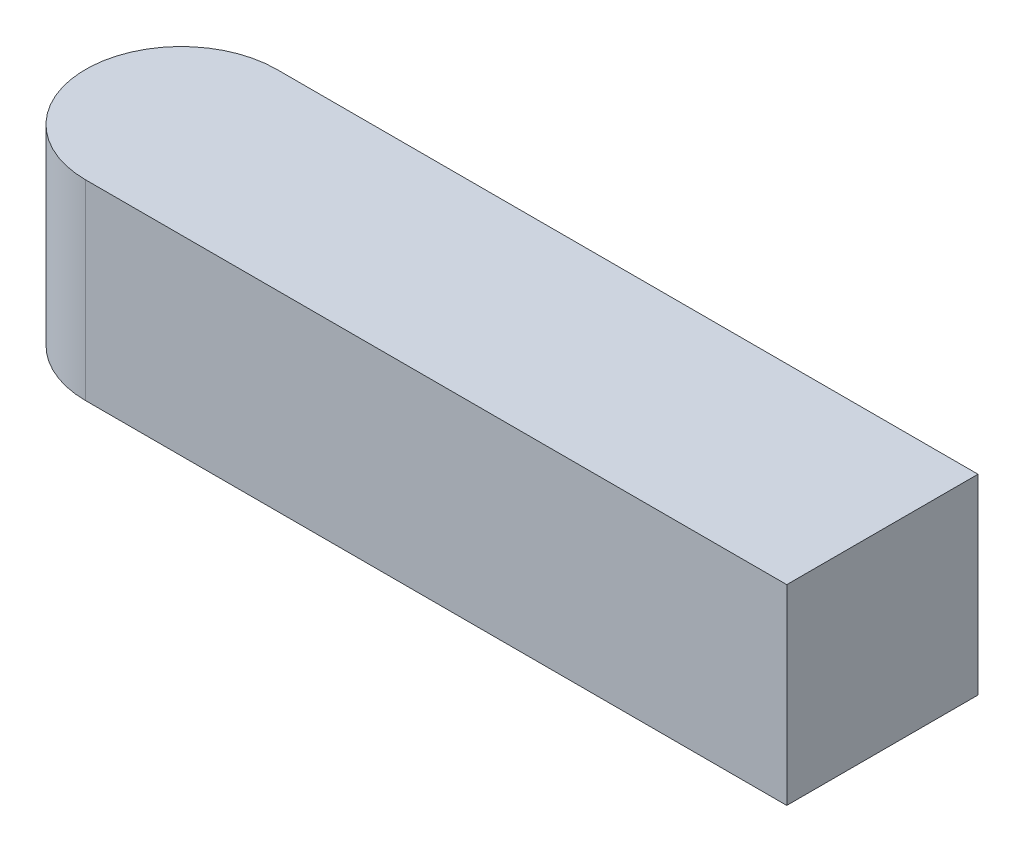
ISO-10303-21;
HEADER;
FILE_DESCRIPTION(('STEP AP214'),'2;1');
FILE_NAME('part.step','',(''),(''),'','','');
FILE_SCHEMA(('AUTOMOTIVE_DESIGN { 1 0 10303 214 1 1 1 1 }'));
ENDSEC;
DATA;
#1=APPLICATION_CONTEXT('core data for automotive mechanical design processes');
#2=APPLICATION_PROTOCOL_DEFINITION('international standard','automotive_design',2000,#1);
#3=PRODUCT_CONTEXT('',#1,'mechanical');
#4=PRODUCT('Part','Part','',(#3));
#5=PRODUCT_RELATED_PRODUCT_CATEGORY('part','',(#4));
#6=PRODUCT_DEFINITION_FORMATION('','',#4);
#7=PRODUCT_DEFINITION_CONTEXT('part definition',#1,'design');
#8=PRODUCT_DEFINITION('design','',#6,#7);
#9=PRODUCT_DEFINITION_SHAPE('','',#8);
#10=(LENGTH_UNIT() NAMED_UNIT(*) SI_UNIT(.MILLI.,.METRE.));
#11=(NAMED_UNIT(*) PLANE_ANGLE_UNIT() SI_UNIT($,.RADIAN.));
#12=(NAMED_UNIT(*) SI_UNIT($,.STERADIAN.) SOLID_ANGLE_UNIT());
#13=UNCERTAINTY_MEASURE_WITH_UNIT(LENGTH_MEASURE(1.E-05),#10,'distance_accuracy_value','');
#14=(GEOMETRIC_REPRESENTATION_CONTEXT(3) GLOBAL_UNCERTAINTY_ASSIGNED_CONTEXT((#13)) GLOBAL_UNIT_ASSIGNED_CONTEXT((#10,
#11,#12)) REPRESENTATION_CONTEXT('',''));
#15=CARTESIAN_POINT('',(0.,0.,0.));
#16=DIRECTION('',(0.,0.,1.));
#17=DIRECTION('',(1.,0.,0.));
#18=AXIS2_PLACEMENT_3D('',#15,#16,#17);
#19=CARTESIAN_POINT('',(-44.,12.,0.));
#20=DIRECTION('',(0.,-1.,0.));
#21=DIRECTION('',(0.,0.,-1.));
#22=AXIS2_PLACEMENT_3D('',#19,#20,#21);
#23=CYLINDRICAL_SURFACE('',#22,6.00000000000002);
#24=CARTESIAN_POINT('',(-44.,0.,0.));
#25=DIRECTION('',(0.,1.,0.));
#26=DIRECTION('',(0.,0.,1.));
#27=AXIS2_PLACEMENT_3D('',#24,#25,#26);
#28=CIRCLE('',#27,6.00000000000002);
#29=CARTESIAN_POINT('',(-44.,0.,-6.00000000000002));
#30=VERTEX_POINT('',#29);
#31=CARTESIAN_POINT('',(-44.,0.,6.00000000000002));
#32=VERTEX_POINT('',#31);
#33=EDGE_CURVE('E86',#30,#32,#28,.T.);
#34=ORIENTED_EDGE('',*,*,#33,.T.);
#35=DIRECTION('',(0.,-1.,0.));
#36=VECTOR('',#35,1.);
#37=CARTESIAN_POINT('',(-44.,12.,6.00000000000002));
#38=LINE('',#37,#36);
#39=CARTESIAN_POINT('',(-44.,12.,6.00000000000002));
#40=VERTEX_POINT('',#39);
#41=EDGE_CURVE('E11',#40,#32,#38,.T.);
#42=ORIENTED_EDGE('',*,*,#41,.F.);
#43=CARTESIAN_POINT('',(-44.,12.,0.));
#44=DIRECTION('',(0.,1.,0.));
#45=DIRECTION('',(0.,0.,1.));
#46=AXIS2_PLACEMENT_3D('',#43,#44,#45);
#47=CIRCLE('',#46,6.00000000000002);
#48=CARTESIAN_POINT('',(-44.,12.,-6.00000000000002));
#49=VERTEX_POINT('',#48);
#50=EDGE_CURVE('E85',#49,#40,#47,.T.);
#51=ORIENTED_EDGE('',*,*,#50,.F.);
#52=DIRECTION('',(0.,-1.,0.));
#53=VECTOR('',#52,1.);
#54=CARTESIAN_POINT('',(-44.,12.,-6.00000000000002));
#55=LINE('',#54,#53);
#56=EDGE_CURVE('E42',#49,#30,#55,.T.);
#57=ORIENTED_EDGE('',*,*,#56,.T.);
#58=EDGE_LOOP('',(#34,#42,#51,#57));
#59=FACE_BOUND('',#58,.T.);
#60=ADVANCED_FACE('F40',(#59),#23,.T.);
#61=CARTESIAN_POINT('',(-44.,12.,6.00000000000002));
#62=DIRECTION('',(0.,0.,-1.));
#63=DIRECTION('',(-1.,0.,0.));
#64=AXIS2_PLACEMENT_3D('',#61,#62,#63);
#65=PLANE('',#64);
#66=DIRECTION('',(1.,0.,0.));
#67=VECTOR('',#66,1.);
#68=CARTESIAN_POINT('',(-44.,0.,6.00000000000002));
#69=LINE('',#68,#67);
#70=CARTESIAN_POINT('',(0.,0.,6.00000000000001));
#71=VERTEX_POINT('',#70);
#72=EDGE_CURVE('E81',#32,#71,#69,.T.);
#73=ORIENTED_EDGE('',*,*,#72,.T.);
#74=DIRECTION('',(0.,1.,0.));
#75=VECTOR('',#74,1.);
#76=CARTESIAN_POINT('',(0.,0.,6.00000000000002));
#77=LINE('',#76,#75);
#78=CARTESIAN_POINT('',(0.,12.,6.00000000000002));
#79=VERTEX_POINT('',#78);
#80=EDGE_CURVE('E51',#71,#79,#77,.T.);
#81=ORIENTED_EDGE('',*,*,#80,.T.);
#82=DIRECTION('',(1.,0.,0.));
#83=VECTOR('',#82,1.);
#84=CARTESIAN_POINT('',(-44.,12.,6.00000000000002));
#85=LINE('',#84,#83);
#86=EDGE_CURVE('E96',#40,#79,#85,.T.);
#87=ORIENTED_EDGE('',*,*,#86,.F.);
#88=ORIENTED_EDGE('',*,*,#41,.T.);
#89=EDGE_LOOP('',(#73,#81,#87,#88));
#90=FACE_BOUND('',#89,.T.);
#91=ADVANCED_FACE('F104',(#90),#65,.F.);
#92=CARTESIAN_POINT('',(-44.,12.,-6.00000000000002));
#93=DIRECTION('',(0.,0.,1.));
#94=DIRECTION('',(1.,0.,0.));
#95=AXIS2_PLACEMENT_3D('',#92,#93,#94);
#96=PLANE('',#95);
#97=DIRECTION('',(-1.,0.,0.));
#98=VECTOR('',#97,1.);
#99=CARTESIAN_POINT('',(-44.,12.,-6.00000000000002));
#100=LINE('',#99,#98);
#101=CARTESIAN_POINT('',(0.,12.,-6.00000000000002));
#102=VERTEX_POINT('',#101);
#103=EDGE_CURVE('E58',#102,#49,#100,.T.);
#104=ORIENTED_EDGE('',*,*,#103,.F.);
#105=DIRECTION('',(0.,1.,0.));
#106=VECTOR('',#105,1.);
#107=CARTESIAN_POINT('',(0.,0.,-6.00000000000002));
#108=LINE('',#107,#106);
#109=CARTESIAN_POINT('',(0.,0.,-6.00000000000002));
#110=VERTEX_POINT('',#109);
#111=EDGE_CURVE('E78',#110,#102,#108,.T.);
#112=ORIENTED_EDGE('',*,*,#111,.F.);
#113=DIRECTION('',(-1.,0.,0.));
#114=VECTOR('',#113,1.);
#115=CARTESIAN_POINT('',(-44.,0.,-6.00000000000002));
#116=LINE('',#115,#114);
#117=EDGE_CURVE('E74',#110,#30,#116,.T.);
#118=ORIENTED_EDGE('',*,*,#117,.T.);
#119=ORIENTED_EDGE('',*,*,#56,.F.);
#120=EDGE_LOOP('',(#104,#112,#118,#119));
#121=FACE_BOUND('',#120,.T.);
#122=ADVANCED_FACE('F79',(#121),#96,.F.);
#123=CARTESIAN_POINT('',(-44.,12.,0.));
#124=DIRECTION('',(0.,1.,0.));
#125=DIRECTION('',(0.,0.,1.));
#126=AXIS2_PLACEMENT_3D('',#123,#124,#125);
#127=PLANE('',#126);
#128=DIRECTION('',(0.,0.,1.));
#129=VECTOR('',#128,1.);
#130=CARTESIAN_POINT('',(0.,12.,-6.00000000000002));
#131=LINE('',#130,#129);
#132=EDGE_CURVE('E105',#102,#79,#131,.T.);
#133=ORIENTED_EDGE('',*,*,#132,.F.);
#134=ORIENTED_EDGE('',*,*,#103,.T.);
#135=ORIENTED_EDGE('',*,*,#50,.T.);
#136=ORIENTED_EDGE('',*,*,#86,.T.);
#137=EDGE_LOOP('',(#133,#134,#135,#136));
#138=FACE_BOUND('',#137,.T.);
#139=ADVANCED_FACE('F110',(#138),#127,.T.);
#140=CARTESIAN_POINT('',(-44.,0.,0.));
#141=DIRECTION('',(0.,1.,0.));
#142=DIRECTION('',(0.,0.,1.));
#143=AXIS2_PLACEMENT_3D('',#140,#141,#142);
#144=PLANE('',#143);
#145=ORIENTED_EDGE('',*,*,#117,.F.);
#146=DIRECTION('',(0.,0.,1.));
#147=VECTOR('',#146,1.);
#148=CARTESIAN_POINT('',(0.,0.,-6.00000000000002));
#149=LINE('',#148,#147);
#150=EDGE_CURVE('E99',#110,#71,#149,.T.);
#151=ORIENTED_EDGE('',*,*,#150,.T.);
#152=ORIENTED_EDGE('',*,*,#72,.F.);
#153=ORIENTED_EDGE('',*,*,#33,.F.);
#154=EDGE_LOOP('',(#145,#151,#152,#153));
#155=FACE_BOUND('',#154,.T.);
#156=ADVANCED_FACE('F90',(#155),#144,.F.);
#157=CARTESIAN_POINT('',(0.,0.,-6.00000000000002));
#158=DIRECTION('',(-1.,0.,0.));
#159=DIRECTION('',(0.,0.,1.));
#160=AXIS2_PLACEMENT_3D('',#157,#158,#159);
#161=PLANE('',#160);
#162=ORIENTED_EDGE('',*,*,#132,.T.);
#163=ORIENTED_EDGE('',*,*,#80,.F.);
#164=ORIENTED_EDGE('',*,*,#150,.F.);
#165=ORIENTED_EDGE('',*,*,#111,.T.);
#166=EDGE_LOOP('',(#162,#163,#164,#165));
#167=FACE_BOUND('',#166,.T.);
#168=ADVANCED_FACE('F113',(#167),#161,.F.);
#169=CLOSED_SHELL('',(#60,#91,#122,#139,#156,#168));
#170=MANIFOLD_SOLID_BREP('B2',#169);
#171=ADVANCED_BREP_SHAPE_REPRESENTATION('',(#18,#170),#14);
#172=SHAPE_DEFINITION_REPRESENTATION(#9,#171);
ENDSEC;
END-ISO-10303-21;
